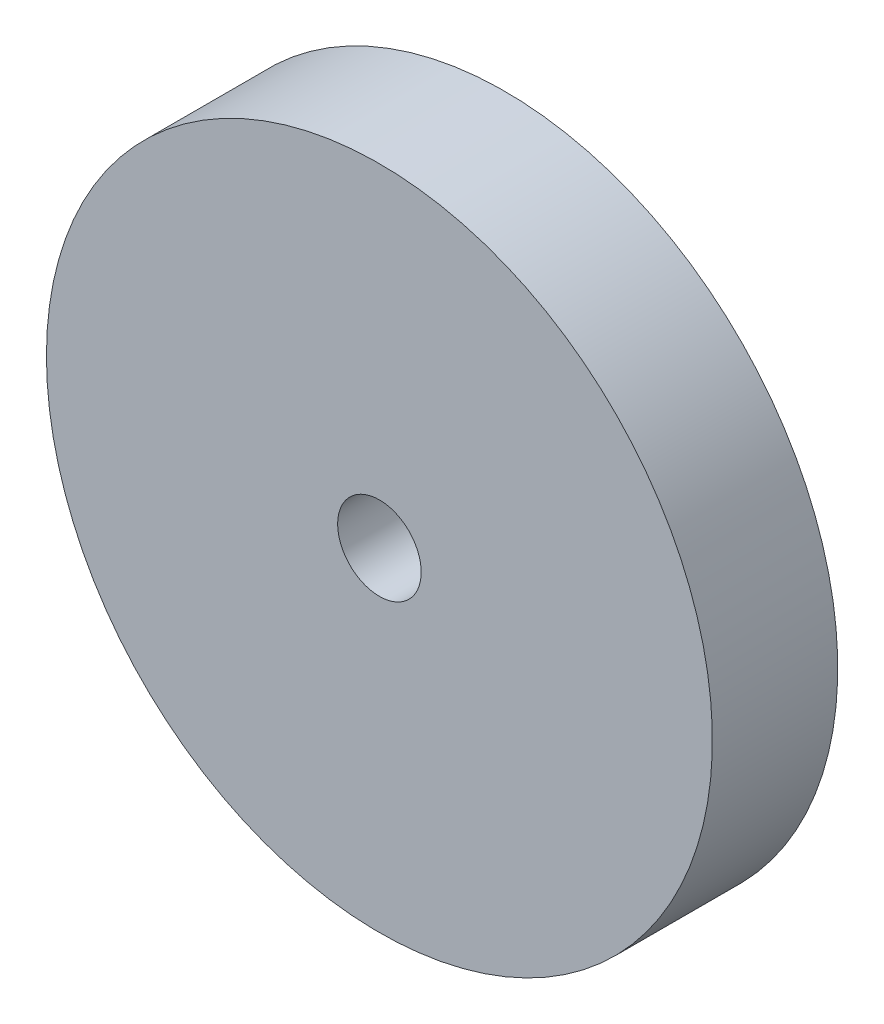
ISO-10303-21;
HEADER;
FILE_DESCRIPTION(('STEP AP214'),'2;1');
FILE_NAME('part.step','',(''),(''),'','','');
FILE_SCHEMA(('AUTOMOTIVE_DESIGN { 1 0 10303 214 1 1 1 1 }'));
ENDSEC;
DATA;
#1=APPLICATION_CONTEXT('core data for automotive mechanical design processes');
#2=APPLICATION_PROTOCOL_DEFINITION('international standard','automotive_design',2000,#1);
#3=PRODUCT_CONTEXT('',#1,'mechanical');
#4=PRODUCT('Part','Part','',(#3));
#5=PRODUCT_RELATED_PRODUCT_CATEGORY('part','',(#4));
#6=PRODUCT_DEFINITION_FORMATION('','',#4);
#7=PRODUCT_DEFINITION_CONTEXT('part definition',#1,'design');
#8=PRODUCT_DEFINITION('design','',#6,#7);
#9=PRODUCT_DEFINITION_SHAPE('','',#8);
#10=(LENGTH_UNIT() NAMED_UNIT(*) SI_UNIT(.MILLI.,.METRE.));
#11=(NAMED_UNIT(*) PLANE_ANGLE_UNIT() SI_UNIT($,.RADIAN.));
#12=(NAMED_UNIT(*) SI_UNIT($,.STERADIAN.) SOLID_ANGLE_UNIT());
#13=UNCERTAINTY_MEASURE_WITH_UNIT(LENGTH_MEASURE(1.E-05),#10,'distance_accuracy_value','');
#14=(GEOMETRIC_REPRESENTATION_CONTEXT(3) GLOBAL_UNCERTAINTY_ASSIGNED_CONTEXT((#13)) GLOBAL_UNIT_ASSIGNED_CONTEXT((#10,
#11,#12)) REPRESENTATION_CONTEXT('',''));
#15=CARTESIAN_POINT('',(0.,0.,0.));
#16=DIRECTION('',(0.,0.,1.));
#17=DIRECTION('',(1.,0.,0.));
#18=AXIS2_PLACEMENT_3D('',#15,#16,#17);
#19=CARTESIAN_POINT('',(0.,0.,76.2));
#20=DIRECTION('',(0.,0.,1.));
#21=DIRECTION('',(1.,0.,0.));
#22=AXIS2_PLACEMENT_3D('',#19,#20,#21);
#23=PLANE('',#22);
#24=CARTESIAN_POINT('',(0.,0.,76.2));
#25=DIRECTION('',(0.,0.,1.));
#26=DIRECTION('',(1.,0.,0.));
#27=AXIS2_PLACEMENT_3D('',#24,#25,#26);
#28=CIRCLE('',#27,202.4);
#29=CARTESIAN_POINT('',(-202.4,0.,76.2));
#30=VERTEX_POINT('',#29);
#31=EDGE_CURVE('E11',#30,#30,#28,.T.);
#32=ORIENTED_EDGE('',*,*,#31,.T.);
#33=EDGE_LOOP('',(#32));
#34=FACE_BOUND('',#33,.T.);
#35=CARTESIAN_POINT('',(0.,0.,76.2));
#36=DIRECTION('',(0.,0.,1.));
#37=DIRECTION('',(1.,0.,0.));
#38=AXIS2_PLACEMENT_3D('',#35,#36,#37);
#39=CIRCLE('',#38,25.4);
#40=CARTESIAN_POINT('',(-25.4,0.,76.2));
#41=VERTEX_POINT('',#40);
#42=EDGE_CURVE('E56',#41,#41,#39,.T.);
#43=ORIENTED_EDGE('',*,*,#42,.F.);
#44=EDGE_LOOP('',(#43));
#45=FACE_BOUND('',#44,.T.);
#46=ADVANCED_FACE('F43',(#34,#45),#23,.T.);
#47=CARTESIAN_POINT('',(0.,0.,0.));
#48=DIRECTION('',(0.,0.,1.));
#49=DIRECTION('',(1.,0.,0.));
#50=AXIS2_PLACEMENT_3D('',#47,#48,#49);
#51=PLANE('',#50);
#52=CARTESIAN_POINT('',(0.,0.,0.));
#53=DIRECTION('',(0.,0.,1.));
#54=DIRECTION('',(1.,0.,0.));
#55=AXIS2_PLACEMENT_3D('',#52,#53,#54);
#56=CIRCLE('',#55,202.4);
#57=CARTESIAN_POINT('',(-202.4,0.,0.));
#58=VERTEX_POINT('',#57);
#59=EDGE_CURVE('E47',#58,#58,#56,.T.);
#60=ORIENTED_EDGE('',*,*,#59,.F.);
#61=EDGE_LOOP('',(#60));
#62=FACE_BOUND('',#61,.T.);
#63=CARTESIAN_POINT('',(0.,0.,0.));
#64=DIRECTION('',(0.,0.,1.));
#65=DIRECTION('',(1.,0.,0.));
#66=AXIS2_PLACEMENT_3D('',#63,#64,#65);
#67=CIRCLE('',#66,25.4);
#68=CARTESIAN_POINT('',(-25.4,0.,0.));
#69=VERTEX_POINT('',#68);
#70=EDGE_CURVE('E58',#69,#69,#67,.T.);
#71=ORIENTED_EDGE('',*,*,#70,.T.);
#72=EDGE_LOOP('',(#71));
#73=FACE_BOUND('',#72,.T.);
#74=ADVANCED_FACE('F70',(#62,#73),#51,.F.);
#75=CARTESIAN_POINT('',(0.,0.,76.2));
#76=DIRECTION('',(0.,0.,-1.));
#77=DIRECTION('',(-1.,0.,0.));
#78=AXIS2_PLACEMENT_3D('',#75,#76,#77);
#79=CYLINDRICAL_SURFACE('',#78,202.4);
#80=CARTESIAN_POINT('',(-202.4,0.,76.2));
#81=CARTESIAN_POINT('',(-202.4,0.,75.40625));
#82=CARTESIAN_POINT('',(-202.4,0.,74.6125));
#83=CARTESIAN_POINT('',(-202.4,0.,73.025));
#84=CARTESIAN_POINT('',(-202.4,0.,72.23125));
#85=CARTESIAN_POINT('',(-202.4,0.,70.64375));
#86=CARTESIAN_POINT('',(-202.4,0.,69.85));
#87=CARTESIAN_POINT('',(-202.4,0.,68.2625));
#88=CARTESIAN_POINT('',(-202.4,0.,67.46875));
#89=CARTESIAN_POINT('',(-202.4,0.,65.88125));
#90=CARTESIAN_POINT('',(-202.4,0.,65.0875));
#91=CARTESIAN_POINT('',(-202.4,0.,63.5));
#92=CARTESIAN_POINT('',(-202.4,0.,62.70625));
#93=CARTESIAN_POINT('',(-202.4,0.,61.11875));
#94=CARTESIAN_POINT('',(-202.4,0.,60.325));
#95=CARTESIAN_POINT('',(-202.4,0.,58.7375));
#96=CARTESIAN_POINT('',(-202.4,0.,57.94375));
#97=CARTESIAN_POINT('',(-202.4,0.,56.35625));
#98=CARTESIAN_POINT('',(-202.4,0.,55.5625));
#99=CARTESIAN_POINT('',(-202.4,0.,53.975));
#100=CARTESIAN_POINT('',(-202.4,0.,53.18125));
#101=CARTESIAN_POINT('',(-202.4,0.,51.59375));
#102=CARTESIAN_POINT('',(-202.4,0.,50.8));
#103=CARTESIAN_POINT('',(-202.4,0.,49.2125));
#104=CARTESIAN_POINT('',(-202.4,0.,48.41875));
#105=CARTESIAN_POINT('',(-202.4,0.,46.83125));
#106=CARTESIAN_POINT('',(-202.4,0.,46.0375));
#107=CARTESIAN_POINT('',(-202.4,0.,44.45));
#108=CARTESIAN_POINT('',(-202.4,0.,43.65625));
#109=CARTESIAN_POINT('',(-202.4,0.,42.06875));
#110=CARTESIAN_POINT('',(-202.4,0.,41.275));
#111=CARTESIAN_POINT('',(-202.4,0.,39.6875));
#112=CARTESIAN_POINT('',(-202.4,0.,38.89375));
#113=CARTESIAN_POINT('',(-202.4,0.,37.30625));
#114=CARTESIAN_POINT('',(-202.4,0.,36.5125));
#115=CARTESIAN_POINT('',(-202.4,0.,34.925));
#116=CARTESIAN_POINT('',(-202.4,0.,34.13125));
#117=CARTESIAN_POINT('',(-202.4,0.,32.54375));
#118=CARTESIAN_POINT('',(-202.4,0.,31.75));
#119=CARTESIAN_POINT('',(-202.4,0.,30.1625));
#120=CARTESIAN_POINT('',(-202.4,0.,29.36875));
#121=CARTESIAN_POINT('',(-202.4,0.,27.78125));
#122=CARTESIAN_POINT('',(-202.4,0.,26.9875));
#123=CARTESIAN_POINT('',(-202.4,0.,25.4));
#124=CARTESIAN_POINT('',(-202.4,0.,24.60625));
#125=CARTESIAN_POINT('',(-202.4,0.,23.01875));
#126=CARTESIAN_POINT('',(-202.4,0.,22.225));
#127=CARTESIAN_POINT('',(-202.4,0.,20.6375));
#128=CARTESIAN_POINT('',(-202.4,0.,19.84375));
#129=CARTESIAN_POINT('',(-202.4,0.,18.25625));
#130=CARTESIAN_POINT('',(-202.4,0.,17.4625));
#131=CARTESIAN_POINT('',(-202.4,0.,15.875));
#132=CARTESIAN_POINT('',(-202.4,0.,15.08125));
#133=CARTESIAN_POINT('',(-202.4,0.,13.49375));
#134=CARTESIAN_POINT('',(-202.4,0.,12.7));
#135=CARTESIAN_POINT('',(-202.4,0.,11.1125));
#136=CARTESIAN_POINT('',(-202.4,0.,10.31875));
#137=CARTESIAN_POINT('',(-202.4,0.,8.73125));
#138=CARTESIAN_POINT('',(-202.4,0.,7.93750000000001));
#139=CARTESIAN_POINT('',(-202.4,0.,6.35));
#140=CARTESIAN_POINT('',(-202.4,0.,5.55625));
#141=CARTESIAN_POINT('',(-202.4,0.,3.96875));
#142=CARTESIAN_POINT('',(-202.4,0.,3.175));
#143=CARTESIAN_POINT('',(-202.4,0.,1.5875));
#144=CARTESIAN_POINT('',(-202.4,0.,0.793750000000001));
#145=CARTESIAN_POINT('',(-202.4,0.,0.));
#146=B_SPLINE_CURVE_WITH_KNOTS('',3,(#80,#81,#82,#83,#84,#85,#86,#87,#88,#89,#90,#91,#92,#93,
#94,#95,#96,#97,#98,#99,#100,#101,#102,#103,#104,#105,#106,#107,#108,#109,#110,#111,#112,#113,
#114,#115,#116,#117,#118,#119,#120,#121,#122,#123,#124,#125,#126,#127,#128,#129,#130,#131,#132,
#133,#134,#135,#136,#137,#138,#139,#140,#141,#142,#143,#144,#145),.UNSPECIFIED.,.F.,.F.,(4,2,2,
2,2,2,2,2,2,2,2,2,2,2,2,2,2,2,2,2,2,2,2,2,2,2,2,2,2,2,2,2,4),(0.,2.38125,4.7625,7.14375,
9.52500000000001,11.90625,14.2875,16.66875,19.05,21.43125,23.8125,26.19375,28.575,30.95625,
33.3375,35.71875,38.1,40.48125,42.8625,45.24375,47.625,50.00625,52.3875,54.76875,57.15,59.53125,
61.9125,64.29375,66.675,69.05625,71.4375,73.81875,76.2),.UNSPECIFIED.);
#147=EDGE_CURVE('BSEAM45',#30,#58,#146,.T.);
#148=ORIENTED_EDGE('',*,*,#31,.F.);
#149=ORIENTED_EDGE('',*,*,#59,.T.);
#150=ORIENTED_EDGE('',*,*,#147,.T.);
#151=ORIENTED_EDGE('',*,*,#147,.F.);
#152=EDGE_LOOP('',(#148,#150,#149,#151));
#153=FACE_BOUND('',#152,.T.);
#154=ADVANCED_FACE('F45',(#153),#79,.T.);
#155=CARTESIAN_POINT('',(0.,0.,76.2));
#156=DIRECTION('',(0.,0.,-1.));
#157=DIRECTION('',(-1.,0.,0.));
#158=AXIS2_PLACEMENT_3D('',#155,#156,#157);
#159=CYLINDRICAL_SURFACE('',#158,25.4);
#160=CARTESIAN_POINT('',(-25.4,0.,76.2));
#161=CARTESIAN_POINT('',(-25.4,0.,75.40625));
#162=CARTESIAN_POINT('',(-25.4,0.,74.6125));
#163=CARTESIAN_POINT('',(-25.4,0.,73.025));
#164=CARTESIAN_POINT('',(-25.4,0.,72.23125));
#165=CARTESIAN_POINT('',(-25.4,0.,70.64375));
#166=CARTESIAN_POINT('',(-25.4,0.,69.85));
#167=CARTESIAN_POINT('',(-25.4,0.,68.2625));
#168=CARTESIAN_POINT('',(-25.4,0.,67.46875));
#169=CARTESIAN_POINT('',(-25.4,0.,65.88125));
#170=CARTESIAN_POINT('',(-25.4,0.,65.0875));
#171=CARTESIAN_POINT('',(-25.4,0.,63.5));
#172=CARTESIAN_POINT('',(-25.4,0.,62.70625));
#173=CARTESIAN_POINT('',(-25.4,0.,61.11875));
#174=CARTESIAN_POINT('',(-25.4,0.,60.325));
#175=CARTESIAN_POINT('',(-25.4,0.,58.7375));
#176=CARTESIAN_POINT('',(-25.4,0.,57.94375));
#177=CARTESIAN_POINT('',(-25.4,0.,56.35625));
#178=CARTESIAN_POINT('',(-25.4,0.,55.5625));
#179=CARTESIAN_POINT('',(-25.4,0.,53.975));
#180=CARTESIAN_POINT('',(-25.4,0.,53.18125));
#181=CARTESIAN_POINT('',(-25.4,0.,51.59375));
#182=CARTESIAN_POINT('',(-25.4,0.,50.8));
#183=CARTESIAN_POINT('',(-25.4,0.,49.2125));
#184=CARTESIAN_POINT('',(-25.4,0.,48.41875));
#185=CARTESIAN_POINT('',(-25.4,0.,46.83125));
#186=CARTESIAN_POINT('',(-25.4,0.,46.0375));
#187=CARTESIAN_POINT('',(-25.4,0.,44.45));
#188=CARTESIAN_POINT('',(-25.4,0.,43.65625));
#189=CARTESIAN_POINT('',(-25.4,0.,42.06875));
#190=CARTESIAN_POINT('',(-25.4,0.,41.275));
#191=CARTESIAN_POINT('',(-25.4,0.,39.6875));
#192=CARTESIAN_POINT('',(-25.4,0.,38.89375));
#193=CARTESIAN_POINT('',(-25.4,0.,37.30625));
#194=CARTESIAN_POINT('',(-25.4,0.,36.5125));
#195=CARTESIAN_POINT('',(-25.4,0.,34.925));
#196=CARTESIAN_POINT('',(-25.4,0.,34.13125));
#197=CARTESIAN_POINT('',(-25.4,0.,32.54375));
#198=CARTESIAN_POINT('',(-25.4,0.,31.75));
#199=CARTESIAN_POINT('',(-25.4,0.,30.1625));
#200=CARTESIAN_POINT('',(-25.4,0.,29.36875));
#201=CARTESIAN_POINT('',(-25.4,0.,27.78125));
#202=CARTESIAN_POINT('',(-25.4,0.,26.9875));
#203=CARTESIAN_POINT('',(-25.4,0.,25.4));
#204=CARTESIAN_POINT('',(-25.4,0.,24.60625));
#205=CARTESIAN_POINT('',(-25.4,0.,23.01875));
#206=CARTESIAN_POINT('',(-25.4,0.,22.225));
#207=CARTESIAN_POINT('',(-25.4,0.,20.6375));
#208=CARTESIAN_POINT('',(-25.4,0.,19.84375));
#209=CARTESIAN_POINT('',(-25.4,0.,18.25625));
#210=CARTESIAN_POINT('',(-25.4,0.,17.4625));
#211=CARTESIAN_POINT('',(-25.4,0.,15.875));
#212=CARTESIAN_POINT('',(-25.4,0.,15.08125));
#213=CARTESIAN_POINT('',(-25.4,0.,13.49375));
#214=CARTESIAN_POINT('',(-25.4,0.,12.7));
#215=CARTESIAN_POINT('',(-25.4,0.,11.1125));
#216=CARTESIAN_POINT('',(-25.4,0.,10.31875));
#217=CARTESIAN_POINT('',(-25.4,0.,8.73125));
#218=CARTESIAN_POINT('',(-25.4,0.,7.93750000000001));
#219=CARTESIAN_POINT('',(-25.4,0.,6.35));
#220=CARTESIAN_POINT('',(-25.4,0.,5.55625));
#221=CARTESIAN_POINT('',(-25.4,0.,3.96875));
#222=CARTESIAN_POINT('',(-25.4,0.,3.175));
#223=CARTESIAN_POINT('',(-25.4,0.,1.5875));
#224=CARTESIAN_POINT('',(-25.4,0.,0.793750000000001));
#225=CARTESIAN_POINT('',(-25.4,0.,0.));
#226=B_SPLINE_CURVE_WITH_KNOTS('',3,(#160,#161,#162,#163,#164,#165,#166,#167,#168,#169,#170,
#171,#172,#173,#174,#175,#176,#177,#178,#179,#180,#181,#182,#183,#184,#185,#186,#187,#188,#189,
#190,#191,#192,#193,#194,#195,#196,#197,#198,#199,#200,#201,#202,#203,#204,#205,#206,#207,#208,
#209,#210,#211,#212,#213,#214,#215,#216,#217,#218,#219,#220,#221,#222,#223,#224,#225),
.UNSPECIFIED.,.F.,.F.,(4,2,2,2,2,2,2,2,2,2,2,2,2,2,2,2,2,2,2,2,2,2,2,2,2,2,2,2,2,2,2,2,4),(0.,
2.38125,4.7625,7.14375,9.52500000000001,11.90625,14.2875,16.66875,19.05,21.43125,23.8125,
26.19375,28.575,30.95625,33.3375,35.71875,38.1,40.48125,42.8625,45.24375,47.625,50.00625,
52.3875,54.76875,57.15,59.53125,61.9125,64.29375,66.675,69.05625,71.4375,73.81875,76.2),.UNSPECIFIED.);
#227=EDGE_CURVE('BSEAM66',#41,#69,#226,.T.);
#228=ORIENTED_EDGE('',*,*,#42,.T.);
#229=ORIENTED_EDGE('',*,*,#70,.F.);
#230=ORIENTED_EDGE('',*,*,#227,.T.);
#231=ORIENTED_EDGE('',*,*,#227,.F.);
#232=EDGE_LOOP('',(#228,#230,#229,#231));
#233=FACE_BOUND('',#232,.T.);
#234=ADVANCED_FACE('F66',(#233),#159,.F.);
#235=CLOSED_SHELL('',(#46,#74,#154,#234));
#236=MANIFOLD_SOLID_BREP('B2',#235);
#237=ADVANCED_BREP_SHAPE_REPRESENTATION('',(#18,#236),#14);
#238=SHAPE_DEFINITION_REPRESENTATION(#9,#237);
ENDSEC;
END-ISO-10303-21;
